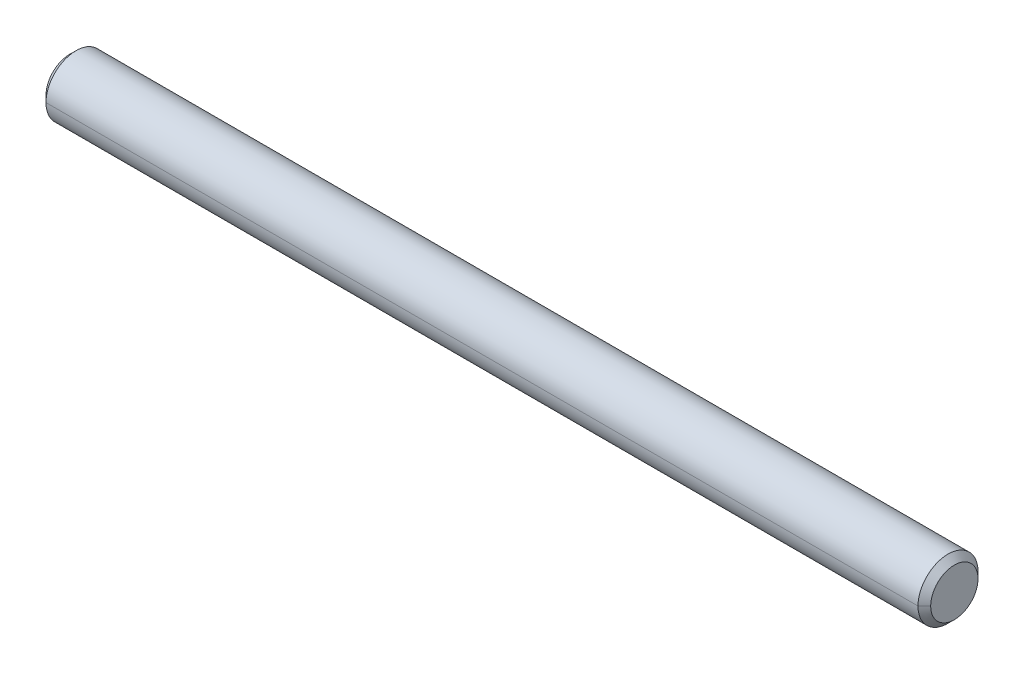
ISO-10303-21;
HEADER;
FILE_DESCRIPTION(('STEP AP214'),'2;1');
FILE_NAME('part.step','',(''),(''),'','','');
FILE_SCHEMA(('AUTOMOTIVE_DESIGN { 1 0 10303 214 1 1 1 1 }'));
ENDSEC;
DATA;
#1=APPLICATION_CONTEXT('core data for automotive mechanical design processes');
#2=APPLICATION_PROTOCOL_DEFINITION('international standard','automotive_design',2000,#1);
#3=PRODUCT_CONTEXT('',#1,'mechanical');
#4=PRODUCT('Part','Part','',(#3));
#5=PRODUCT_RELATED_PRODUCT_CATEGORY('part','',(#4));
#6=PRODUCT_DEFINITION_FORMATION('','',#4);
#7=PRODUCT_DEFINITION_CONTEXT('part definition',#1,'design');
#8=PRODUCT_DEFINITION('design','',#6,#7);
#9=PRODUCT_DEFINITION_SHAPE('','',#8);
#10=(LENGTH_UNIT() NAMED_UNIT(*) SI_UNIT(.MILLI.,.METRE.));
#11=(NAMED_UNIT(*) PLANE_ANGLE_UNIT() SI_UNIT($,.RADIAN.));
#12=(NAMED_UNIT(*) SI_UNIT($,.STERADIAN.) SOLID_ANGLE_UNIT());
#13=UNCERTAINTY_MEASURE_WITH_UNIT(LENGTH_MEASURE(1.E-05),#10,'distance_accuracy_value','');
#14=(GEOMETRIC_REPRESENTATION_CONTEXT(3) GLOBAL_UNCERTAINTY_ASSIGNED_CONTEXT((#13)) GLOBAL_UNIT_ASSIGNED_CONTEXT((#10,
#11,#12)) REPRESENTATION_CONTEXT('',''));
#15=CARTESIAN_POINT('',(0.,0.,0.));
#16=DIRECTION('',(0.,0.,1.));
#17=DIRECTION('',(1.,0.,0.));
#18=AXIS2_PLACEMENT_3D('',#15,#16,#17);
#19=CARTESIAN_POINT('',(34.925,0.,0.));
#20=DIRECTION('',(-1.,0.,0.));
#21=DIRECTION('',(0.,0.,1.));
#22=AXIS2_PLACEMENT_3D('',#19,#20,#21);
#23=CONICAL_SURFACE('',#22,1.86855,0.785398163397445);
#24=DIRECTION('',(-0.70710678118655,0.,-0.707106781186545));
#25=VECTOR('',#24,1.);
#26=CARTESIAN_POINT('',(34.925,0.,-1.86855));
#27=LINE('',#26,#25);
#28=CARTESIAN_POINT('',(34.925,0.,-1.86855));
#29=VERTEX_POINT('',#28);
#30=CARTESIAN_POINT('',(34.425,0.,-2.36855));
#31=VERTEX_POINT('',#30);
#32=EDGE_CURVE('E19',#29,#31,#27,.T.);
#33=ORIENTED_EDGE('',*,*,#32,.F.);
#34=CARTESIAN_POINT('',(34.925,0.,0.));
#35=DIRECTION('',(1.,0.,0.));
#36=DIRECTION('',(0.,0.,-1.));
#37=AXIS2_PLACEMENT_3D('',#34,#35,#36);
#38=CIRCLE('',#37,1.86855);
#39=CARTESIAN_POINT('',(34.925,0.,1.86855));
#40=VERTEX_POINT('',#39);
#41=EDGE_CURVE('E26',#40,#29,#38,.T.);
#42=ORIENTED_EDGE('',*,*,#41,.F.);
#43=DIRECTION('',(-0.70710678118655,0.,0.707106781186545));
#44=VECTOR('',#43,1.);
#45=CARTESIAN_POINT('',(34.925,0.,1.86855));
#46=LINE('',#45,#44);
#47=CARTESIAN_POINT('',(34.425,0.,2.36855));
#48=VERTEX_POINT('',#47);
#49=EDGE_CURVE('E70',#40,#48,#46,.T.);
#50=ORIENTED_EDGE('',*,*,#49,.T.);
#51=CARTESIAN_POINT('',(34.425,0.,0.));
#52=DIRECTION('',(-1.,0.,0.));
#53=DIRECTION('',(0.,0.,-1.));
#54=AXIS2_PLACEMENT_3D('',#51,#52,#53);
#55=CIRCLE('',#54,2.36855);
#56=EDGE_CURVE('E66',#31,#48,#55,.T.);
#57=ORIENTED_EDGE('',*,*,#56,.F.);
#58=EDGE_LOOP('',(#33,#42,#50,#57));
#59=FACE_BOUND('',#58,.T.);
#60=ADVANCED_FACE('F16',(#59),#23,.T.);
#61=CARTESIAN_POINT('',(-34.425,0.,0.));
#62=DIRECTION('',(1.,0.,0.));
#63=DIRECTION('',(0.,0.,-1.));
#64=AXIS2_PLACEMENT_3D('',#61,#62,#63);
#65=CONICAL_SURFACE('',#64,2.36855,0.785398163397445);
#66=DIRECTION('',(0.70710678118655,0.,0.707106781186545));
#67=VECTOR('',#66,1.);
#68=CARTESIAN_POINT('',(-34.425,0.,2.36855));
#69=LINE('',#68,#67);
#70=CARTESIAN_POINT('',(-34.925,0.,1.86855));
#71=VERTEX_POINT('',#70);
#72=CARTESIAN_POINT('',(-34.425,0.,2.36855));
#73=VERTEX_POINT('',#72);
#74=EDGE_CURVE('E117',#71,#73,#69,.T.);
#75=ORIENTED_EDGE('',*,*,#74,.F.);
#76=CARTESIAN_POINT('',(-34.925,0.,0.));
#77=DIRECTION('',(-1.,0.,0.));
#78=DIRECTION('',(0.,0.,-1.));
#79=AXIS2_PLACEMENT_3D('',#76,#77,#78);
#80=CIRCLE('',#79,1.86855);
#81=CARTESIAN_POINT('',(-34.925,0.,-1.86855));
#82=VERTEX_POINT('',#81);
#83=EDGE_CURVE('E11',#82,#71,#80,.T.);
#84=ORIENTED_EDGE('',*,*,#83,.F.);
#85=DIRECTION('',(0.70710678118655,0.,-0.707106781186545));
#86=VECTOR('',#85,1.);
#87=CARTESIAN_POINT('',(-34.425,0.,-2.36855));
#88=LINE('',#87,#86);
#89=CARTESIAN_POINT('',(-34.425,0.,-2.36855));
#90=VERTEX_POINT('',#89);
#91=EDGE_CURVE('E83',#82,#90,#88,.T.);
#92=ORIENTED_EDGE('',*,*,#91,.T.);
#93=CARTESIAN_POINT('',(-34.425,0.,0.));
#94=DIRECTION('',(1.,0.,0.));
#95=DIRECTION('',(0.,0.,-1.));
#96=AXIS2_PLACEMENT_3D('',#93,#94,#95);
#97=CIRCLE('',#96,2.36855);
#98=EDGE_CURVE('E41',#73,#90,#97,.T.);
#99=ORIENTED_EDGE('',*,*,#98,.F.);
#100=EDGE_LOOP('',(#75,#84,#92,#99));
#101=FACE_BOUND('',#100,.T.);
#102=ADVANCED_FACE('F134',(#101),#65,.T.);
#103=CARTESIAN_POINT('',(-34.925,0.,0.));
#104=DIRECTION('',(1.,0.,0.));
#105=DIRECTION('',(0.,1.,0.));
#106=AXIS2_PLACEMENT_3D('',#103,#104,#105);
#107=PLANE('',#106);
#108=ORIENTED_EDGE('',*,*,#83,.T.);
#109=CARTESIAN_POINT('',(-34.925,0.,0.));
#110=DIRECTION('',(-1.,0.,0.));
#111=DIRECTION('',(0.,0.,-1.));
#112=AXIS2_PLACEMENT_3D('',#109,#110,#111);
#113=CIRCLE('',#112,1.86855);
#114=EDGE_CURVE('E109',#71,#82,#113,.T.);
#115=ORIENTED_EDGE('',*,*,#114,.T.);
#116=EDGE_LOOP('',(#108,#115));
#117=FACE_BOUND('',#116,.T.);
#118=ADVANCED_FACE('F220',(#117),#107,.F.);
#119=CARTESIAN_POINT('',(34.925,0.,0.));
#120=DIRECTION('',(1.,0.,0.));
#121=DIRECTION('',(0.,1.,0.));
#122=AXIS2_PLACEMENT_3D('',#119,#120,#121);
#123=PLANE('',#122);
#124=ORIENTED_EDGE('',*,*,#41,.T.);
#125=CARTESIAN_POINT('',(34.925,0.,0.));
#126=DIRECTION('',(1.,0.,0.));
#127=DIRECTION('',(0.,0.,-1.));
#128=AXIS2_PLACEMENT_3D('',#125,#126,#127);
#129=CIRCLE('',#128,1.86855);
#130=EDGE_CURVE('E92',#29,#40,#129,.T.);
#131=ORIENTED_EDGE('',*,*,#130,.T.);
#132=EDGE_LOOP('',(#124,#131));
#133=FACE_BOUND('',#132,.T.);
#134=ADVANCED_FACE('F216',(#133),#123,.T.);
#135=CARTESIAN_POINT('',(34.925,0.,0.));
#136=DIRECTION('',(-1.,0.,0.));
#137=DIRECTION('',(0.,0.,1.));
#138=AXIS2_PLACEMENT_3D('',#135,#136,#137);
#139=CYLINDRICAL_SURFACE('',#138,2.36855);
#140=DIRECTION('',(-1.,0.,0.));
#141=VECTOR('',#140,1.);
#142=CARTESIAN_POINT('',(34.925,0.,-2.36855));
#143=LINE('',#142,#141);
#144=EDGE_CURVE('E76',#31,#90,#143,.T.);
#145=ORIENTED_EDGE('',*,*,#144,.F.);
#146=ORIENTED_EDGE('',*,*,#56,.T.);
#147=DIRECTION('',(-1.,0.,0.));
#148=VECTOR('',#147,1.);
#149=CARTESIAN_POINT('',(34.925,0.,2.36855));
#150=LINE('',#149,#148);
#151=EDGE_CURVE('E74',#48,#73,#150,.T.);
#152=ORIENTED_EDGE('',*,*,#151,.T.);
#153=ORIENTED_EDGE('',*,*,#98,.T.);
#154=EDGE_LOOP('',(#145,#146,#152,#153));
#155=FACE_BOUND('',#154,.T.);
#156=ADVANCED_FACE('F78',(#155),#139,.T.);
#157=CARTESIAN_POINT('',(34.925,0.,0.));
#158=DIRECTION('',(-1.,0.,0.));
#159=DIRECTION('',(0.,0.,1.));
#160=AXIS2_PLACEMENT_3D('',#157,#158,#159);
#161=CYLINDRICAL_SURFACE('',#160,2.36855);
#162=CARTESIAN_POINT('',(34.425,0.,0.));
#163=DIRECTION('',(-1.,0.,0.));
#164=DIRECTION('',(0.,0.,-1.));
#165=AXIS2_PLACEMENT_3D('',#162,#163,#164);
#166=CIRCLE('',#165,2.36855);
#167=EDGE_CURVE('E85',#48,#31,#166,.T.);
#168=ORIENTED_EDGE('',*,*,#167,.T.);
#169=ORIENTED_EDGE('',*,*,#144,.T.);
#170=CARTESIAN_POINT('',(-34.425,0.,0.));
#171=DIRECTION('',(1.,0.,0.));
#172=DIRECTION('',(0.,0.,-1.));
#173=AXIS2_PLACEMENT_3D('',#170,#171,#172);
#174=CIRCLE('',#173,2.36855);
#175=EDGE_CURVE('E107',#90,#73,#174,.T.);
#176=ORIENTED_EDGE('',*,*,#175,.T.);
#177=ORIENTED_EDGE('',*,*,#151,.F.);
#178=EDGE_LOOP('',(#168,#169,#176,#177));
#179=FACE_BOUND('',#178,.T.);
#180=ADVANCED_FACE('F86',(#179),#161,.T.);
#181=CARTESIAN_POINT('',(-34.425,0.,0.));
#182=DIRECTION('',(1.,0.,0.));
#183=DIRECTION('',(0.,0.,-1.));
#184=AXIS2_PLACEMENT_3D('',#181,#182,#183);
#185=CONICAL_SURFACE('',#184,2.36855,0.785398163397445);
#186=ORIENTED_EDGE('',*,*,#114,.F.);
#187=ORIENTED_EDGE('',*,*,#74,.T.);
#188=ORIENTED_EDGE('',*,*,#175,.F.);
#189=ORIENTED_EDGE('',*,*,#91,.F.);
#190=EDGE_LOOP('',(#186,#187,#188,#189));
#191=FACE_BOUND('',#190,.T.);
#192=ADVANCED_FACE('F133',(#191),#185,.T.);
#193=CARTESIAN_POINT('',(34.925,0.,0.));
#194=DIRECTION('',(-1.,0.,0.));
#195=DIRECTION('',(0.,0.,1.));
#196=AXIS2_PLACEMENT_3D('',#193,#194,#195);
#197=CONICAL_SURFACE('',#196,1.86855,0.785398163397445);
#198=ORIENTED_EDGE('',*,*,#130,.F.);
#199=ORIENTED_EDGE('',*,*,#32,.T.);
#200=ORIENTED_EDGE('',*,*,#167,.F.);
#201=ORIENTED_EDGE('',*,*,#49,.F.);
#202=EDGE_LOOP('',(#198,#199,#200,#201));
#203=FACE_BOUND('',#202,.T.);
#204=ADVANCED_FACE('F90',(#203),#197,.T.);
#205=CLOSED_SHELL('',(#60,#102,#118,#134,#156,#180,#192,#204));
#206=MANIFOLD_SOLID_BREP('B1',#205);
#207=ADVANCED_BREP_SHAPE_REPRESENTATION('',(#18,#206),#14);
#208=SHAPE_DEFINITION_REPRESENTATION(#9,#207);
ENDSEC;
END-ISO-10303-21;
